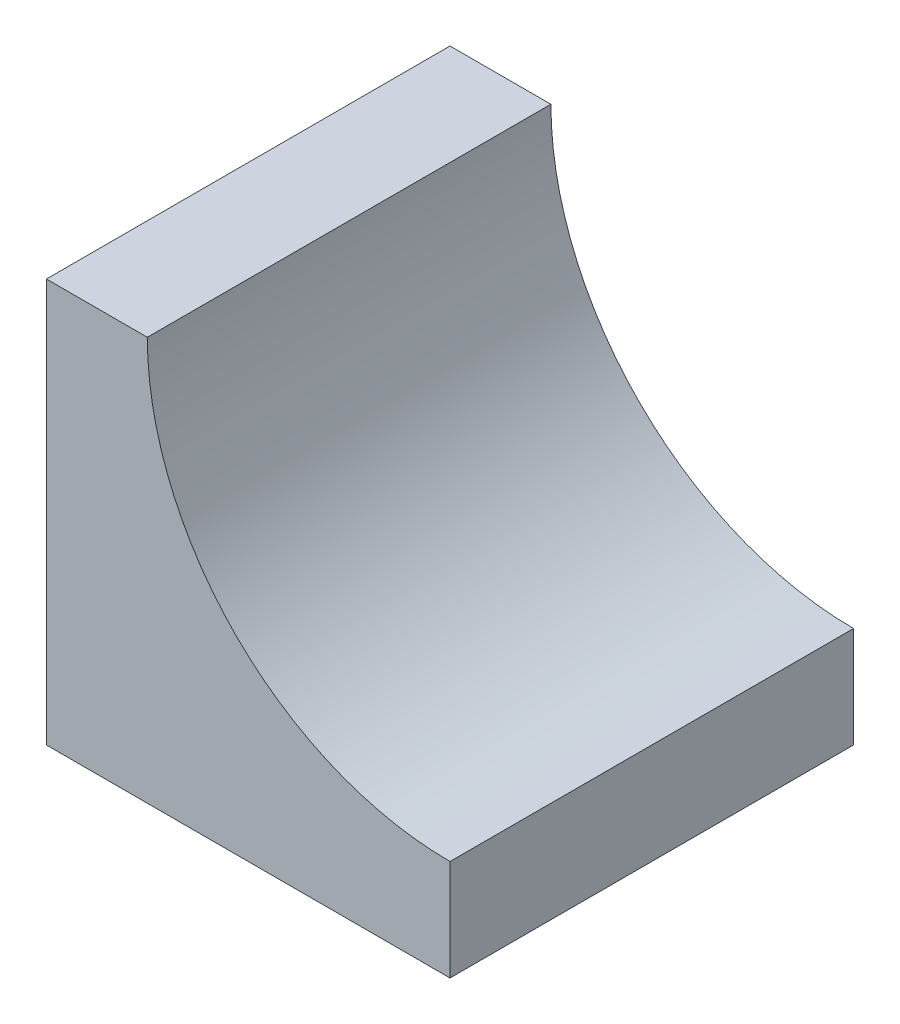
ISO-10303-21;
HEADER;
FILE_DESCRIPTION(('STEP AP214'),'2;1');
FILE_NAME('part.step','',(''),(''),'','','');
FILE_SCHEMA(('AUTOMOTIVE_DESIGN { 1 0 10303 214 1 1 1 1 }'));
ENDSEC;
DATA;
#1=APPLICATION_CONTEXT('core data for automotive mechanical design processes');
#2=APPLICATION_PROTOCOL_DEFINITION('international standard','automotive_design',2000,#1);
#3=PRODUCT_CONTEXT('',#1,'mechanical');
#4=PRODUCT('Part','Part','',(#3));
#5=PRODUCT_RELATED_PRODUCT_CATEGORY('part','',(#4));
#6=PRODUCT_DEFINITION_FORMATION('','',#4);
#7=PRODUCT_DEFINITION_CONTEXT('part definition',#1,'design');
#8=PRODUCT_DEFINITION('design','',#6,#7);
#9=PRODUCT_DEFINITION_SHAPE('','',#8);
#10=(LENGTH_UNIT() NAMED_UNIT(*) SI_UNIT(.MILLI.,.METRE.));
#11=(NAMED_UNIT(*) PLANE_ANGLE_UNIT() SI_UNIT($,.RADIAN.));
#12=(NAMED_UNIT(*) SI_UNIT($,.STERADIAN.) SOLID_ANGLE_UNIT());
#13=UNCERTAINTY_MEASURE_WITH_UNIT(LENGTH_MEASURE(1.E-05),#10,'distance_accuracy_value','');
#14=(GEOMETRIC_REPRESENTATION_CONTEXT(3) GLOBAL_UNCERTAINTY_ASSIGNED_CONTEXT((#13)) GLOBAL_UNIT_ASSIGNED_CONTEXT((#10,
#11,#12)) REPRESENTATION_CONTEXT('',''));
#15=CARTESIAN_POINT('',(0.,0.,0.));
#16=DIRECTION('',(0.,0.,1.));
#17=DIRECTION('',(1.,0.,0.));
#18=AXIS2_PLACEMENT_3D('',#15,#16,#17);
#19=CARTESIAN_POINT('',(0.,0.,20.));
#20=DIRECTION('',(1.,0.,0.));
#21=DIRECTION('',(0.,0.,-1.));
#22=AXIS2_PLACEMENT_3D('',#19,#20,#21);
#23=PLANE('',#22);
#24=DIRECTION('',(0.,-1.,0.));
#25=VECTOR('',#24,1.);
#26=CARTESIAN_POINT('',(0.,0.,0.));
#27=LINE('',#26,#25);
#28=CARTESIAN_POINT('',(0.,20.,0.));
#29=VERTEX_POINT('',#28);
#30=CARTESIAN_POINT('',(0.,0.,0.));
#31=VERTEX_POINT('',#30);
#32=EDGE_CURVE('E107',#29,#31,#27,.T.);
#33=ORIENTED_EDGE('',*,*,#32,.T.);
#34=DIRECTION('',(0.,0.,-1.));
#35=VECTOR('',#34,1.);
#36=CARTESIAN_POINT('',(0.,0.,20.));
#37=LINE('',#36,#35);
#38=CARTESIAN_POINT('',(0.,0.,20.));
#39=VERTEX_POINT('',#38);
#40=EDGE_CURVE('E11',#39,#31,#37,.T.);
#41=ORIENTED_EDGE('',*,*,#40,.F.);
#42=DIRECTION('',(0.,-1.,0.));
#43=VECTOR('',#42,1.);
#44=CARTESIAN_POINT('',(0.,0.,20.));
#45=LINE('',#44,#43);
#46=CARTESIAN_POINT('',(0.,20.,20.));
#47=VERTEX_POINT('',#46);
#48=EDGE_CURVE('E115',#47,#39,#45,.T.);
#49=ORIENTED_EDGE('',*,*,#48,.F.);
#50=DIRECTION('',(0.,0.,-1.));
#51=VECTOR('',#50,1.);
#52=CARTESIAN_POINT('',(0.,20.,20.));
#53=LINE('',#52,#51);
#54=EDGE_CURVE('E103',#47,#29,#53,.T.);
#55=ORIENTED_EDGE('',*,*,#54,.T.);
#56=EDGE_LOOP('',(#33,#41,#49,#55));
#57=FACE_BOUND('',#56,.T.);
#58=ADVANCED_FACE('F33',(#57),#23,.F.);
#59=CARTESIAN_POINT('',(0.,0.,20.));
#60=DIRECTION('',(0.,1.,0.));
#61=DIRECTION('',(0.,0.,1.));
#62=AXIS2_PLACEMENT_3D('',#59,#60,#61);
#63=PLANE('',#62);
#64=DIRECTION('',(1.,0.,0.));
#65=VECTOR('',#64,1.);
#66=CARTESIAN_POINT('',(0.,0.,0.));
#67=LINE('',#66,#65);
#68=CARTESIAN_POINT('',(20.,0.,0.));
#69=VERTEX_POINT('',#68);
#70=EDGE_CURVE('E110',#31,#69,#67,.T.);
#71=ORIENTED_EDGE('',*,*,#70,.T.);
#72=DIRECTION('',(0.,0.,-1.));
#73=VECTOR('',#72,1.);
#74=CARTESIAN_POINT('',(20.,0.,20.));
#75=LINE('',#74,#73);
#76=CARTESIAN_POINT('',(20.,0.,20.));
#77=VERTEX_POINT('',#76);
#78=EDGE_CURVE('E41',#77,#69,#75,.T.);
#79=ORIENTED_EDGE('',*,*,#78,.F.);
#80=DIRECTION('',(1.,0.,0.));
#81=VECTOR('',#80,1.);
#82=CARTESIAN_POINT('',(0.,0.,20.));
#83=LINE('',#82,#81);
#84=EDGE_CURVE('E83',#39,#77,#83,.T.);
#85=ORIENTED_EDGE('',*,*,#84,.F.);
#86=ORIENTED_EDGE('',*,*,#40,.T.);
#87=EDGE_LOOP('',(#71,#79,#85,#86));
#88=FACE_BOUND('',#87,.T.);
#89=ADVANCED_FACE('F134',(#88),#63,.F.);
#90=CARTESIAN_POINT('',(20.,5.,20.));
#91=DIRECTION('',(-1.,0.,0.));
#92=DIRECTION('',(0.,0.,1.));
#93=AXIS2_PLACEMENT_3D('',#90,#91,#92);
#94=PLANE('',#93);
#95=DIRECTION('',(0.,1.,0.));
#96=VECTOR('',#95,1.);
#97=CARTESIAN_POINT('',(20.,5.,0.));
#98=LINE('',#97,#96);
#99=CARTESIAN_POINT('',(20.,5.,0.));
#100=VERTEX_POINT('',#99);
#101=EDGE_CURVE('E98',#69,#100,#98,.T.);
#102=ORIENTED_EDGE('',*,*,#101,.T.);
#103=DIRECTION('',(0.,0.,-1.));
#104=VECTOR('',#103,1.);
#105=CARTESIAN_POINT('',(20.,5.,20.));
#106=LINE('',#105,#104);
#107=CARTESIAN_POINT('',(20.,5.,20.));
#108=VERTEX_POINT('',#107);
#109=EDGE_CURVE('E95',#108,#100,#106,.T.);
#110=ORIENTED_EDGE('',*,*,#109,.F.);
#111=DIRECTION('',(0.,1.,0.));
#112=VECTOR('',#111,1.);
#113=CARTESIAN_POINT('',(20.,5.,20.));
#114=LINE('',#113,#112);
#115=EDGE_CURVE('E87',#77,#108,#114,.T.);
#116=ORIENTED_EDGE('',*,*,#115,.F.);
#117=ORIENTED_EDGE('',*,*,#78,.T.);
#118=EDGE_LOOP('',(#102,#110,#116,#117));
#119=FACE_BOUND('',#118,.T.);
#120=ADVANCED_FACE('F96',(#119),#94,.F.);
#121=CARTESIAN_POINT('',(20.,20.,20.));
#122=DIRECTION('',(0.,0.,-1.));
#123=DIRECTION('',(-1.,0.,0.));
#124=AXIS2_PLACEMENT_3D('',#121,#122,#123);
#125=CYLINDRICAL_SURFACE('',#124,15.);
#126=CARTESIAN_POINT('',(20.,20.,0.));
#127=DIRECTION('',(0.,0.,-1.));
#128=DIRECTION('',(1.,0.,0.));
#129=AXIS2_PLACEMENT_3D('',#126,#127,#128);
#130=CIRCLE('',#129,15.);
#131=CARTESIAN_POINT('',(5.,20.,0.));
#132=VERTEX_POINT('',#131);
#133=EDGE_CURVE('E69',#100,#132,#130,.T.);
#134=ORIENTED_EDGE('',*,*,#133,.T.);
#135=DIRECTION('',(0.,0.,-1.));
#136=VECTOR('',#135,1.);
#137=CARTESIAN_POINT('',(5.,20.,20.));
#138=LINE('',#137,#136);
#139=CARTESIAN_POINT('',(5.,20.,20.));
#140=VERTEX_POINT('',#139);
#141=EDGE_CURVE('E99',#140,#132,#138,.T.);
#142=ORIENTED_EDGE('',*,*,#141,.F.);
#143=CARTESIAN_POINT('',(20.,20.,20.));
#144=DIRECTION('',(0.,0.,-1.));
#145=DIRECTION('',(1.,0.,0.));
#146=AXIS2_PLACEMENT_3D('',#143,#144,#145);
#147=CIRCLE('',#146,15.);
#148=EDGE_CURVE('E91',#108,#140,#147,.T.);
#149=ORIENTED_EDGE('',*,*,#148,.F.);
#150=ORIENTED_EDGE('',*,*,#109,.T.);
#151=EDGE_LOOP('',(#134,#142,#149,#150));
#152=FACE_BOUND('',#151,.T.);
#153=ADVANCED_FACE('F101',(#152),#125,.F.);
#154=CARTESIAN_POINT('',(0.,20.,20.));
#155=DIRECTION('',(0.,-1.,0.));
#156=DIRECTION('',(0.,0.,-1.));
#157=AXIS2_PLACEMENT_3D('',#154,#155,#156);
#158=PLANE('',#157);
#159=DIRECTION('',(-1.,0.,0.));
#160=VECTOR('',#159,1.);
#161=CARTESIAN_POINT('',(0.,20.,0.));
#162=LINE('',#161,#160);
#163=EDGE_CURVE('E75',#132,#29,#162,.T.);
#164=ORIENTED_EDGE('',*,*,#163,.T.);
#165=ORIENTED_EDGE('',*,*,#54,.F.);
#166=DIRECTION('',(-1.,0.,0.));
#167=VECTOR('',#166,1.);
#168=CARTESIAN_POINT('',(0.,20.,20.));
#169=LINE('',#168,#167);
#170=EDGE_CURVE('E49',#140,#47,#169,.T.);
#171=ORIENTED_EDGE('',*,*,#170,.F.);
#172=ORIENTED_EDGE('',*,*,#141,.T.);
#173=EDGE_LOOP('',(#164,#165,#171,#172));
#174=FACE_BOUND('',#173,.T.);
#175=ADVANCED_FACE('F123',(#174),#158,.F.);
#176=CARTESIAN_POINT('',(20.,20.,20.));
#177=DIRECTION('',(0.,0.,1.));
#178=DIRECTION('',(1.,0.,0.));
#179=AXIS2_PLACEMENT_3D('',#176,#177,#178);
#180=PLANE('',#179);
#181=ORIENTED_EDGE('',*,*,#48,.T.);
#182=ORIENTED_EDGE('',*,*,#84,.T.);
#183=ORIENTED_EDGE('',*,*,#115,.T.);
#184=ORIENTED_EDGE('',*,*,#148,.T.);
#185=ORIENTED_EDGE('',*,*,#170,.T.);
#186=EDGE_LOOP('',(#181,#182,#183,#184,#185));
#187=FACE_BOUND('',#186,.T.);
#188=ADVANCED_FACE('F89',(#187),#180,.T.);
#189=CARTESIAN_POINT('',(20.,20.,0.));
#190=DIRECTION('',(0.,0.,1.));
#191=DIRECTION('',(1.,0.,0.));
#192=AXIS2_PLACEMENT_3D('',#189,#190,#191);
#193=PLANE('',#192);
#194=ORIENTED_EDGE('',*,*,#32,.F.);
#195=ORIENTED_EDGE('',*,*,#163,.F.);
#196=ORIENTED_EDGE('',*,*,#133,.F.);
#197=ORIENTED_EDGE('',*,*,#101,.F.);
#198=ORIENTED_EDGE('',*,*,#70,.F.);
#199=EDGE_LOOP('',(#194,#195,#196,#197,#198));
#200=FACE_BOUND('',#199,.T.);
#201=ADVANCED_FACE('F119',(#200),#193,.F.);
#202=CLOSED_SHELL('',(#58,#89,#120,#153,#175,#188,#201));
#203=MANIFOLD_SOLID_BREP('B2',#202);
#204=ADVANCED_BREP_SHAPE_REPRESENTATION('',(#18,#203),#14);
#205=SHAPE_DEFINITION_REPRESENTATION(#9,#204);
ENDSEC;
END-ISO-10303-21;
